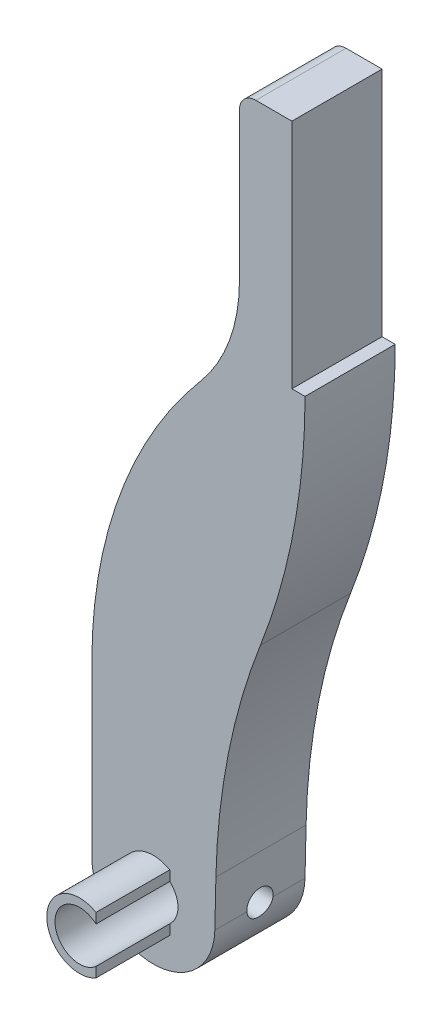
ISO-10303-21;
HEADER;
FILE_DESCRIPTION(('STEP AP214'),'2;1');
FILE_NAME('part.step','',(''),(''),'','','');
FILE_SCHEMA(('AUTOMOTIVE_DESIGN { 1 0 10303 214 1 1 1 1 }'));
ENDSEC;
DATA;
#1=APPLICATION_CONTEXT('core data for automotive mechanical design processes');
#2=APPLICATION_PROTOCOL_DEFINITION('international standard','automotive_design',2000,#1);
#3=PRODUCT_CONTEXT('',#1,'mechanical');
#4=PRODUCT('Part','Part','',(#3));
#5=PRODUCT_RELATED_PRODUCT_CATEGORY('part','',(#4));
#6=PRODUCT_DEFINITION_FORMATION('','',#4);
#7=PRODUCT_DEFINITION_CONTEXT('part definition',#1,'design');
#8=PRODUCT_DEFINITION('design','',#6,#7);
#9=PRODUCT_DEFINITION_SHAPE('','',#8);
#10=(LENGTH_UNIT() NAMED_UNIT(*) SI_UNIT(.MILLI.,.METRE.));
#11=(NAMED_UNIT(*) PLANE_ANGLE_UNIT() SI_UNIT($,.RADIAN.));
#12=(NAMED_UNIT(*) SI_UNIT($,.STERADIAN.) SOLID_ANGLE_UNIT());
#13=UNCERTAINTY_MEASURE_WITH_UNIT(LENGTH_MEASURE(1.E-05),#10,'distance_accuracy_value','');
#14=(GEOMETRIC_REPRESENTATION_CONTEXT(3) GLOBAL_UNCERTAINTY_ASSIGNED_CONTEXT((#13)) GLOBAL_UNIT_ASSIGNED_CONTEXT((#10,
#11,#12)) REPRESENTATION_CONTEXT('',''));
#15=CARTESIAN_POINT('',(0.,0.,0.));
#16=DIRECTION('',(0.,0.,1.));
#17=DIRECTION('',(1.,0.,0.));
#18=AXIS2_PLACEMENT_3D('',#15,#16,#17);
#19=CARTESIAN_POINT('',(0.,0.,-5.5));
#20=DIRECTION('',(0.,0.,1.));
#21=DIRECTION('',(-1.,0.,0.));
#22=AXIS2_PLACEMENT_3D('',#19,#20,#21);
#23=CYLINDRICAL_SURFACE('',#22,1.5);
#24=CARTESIAN_POINT('',(0.,0.,-5.5));
#25=DIRECTION('',(0.,0.,1.));
#26=DIRECTION('',(1.,0.,0.));
#27=AXIS2_PLACEMENT_3D('',#24,#25,#26);
#28=CIRCLE('',#27,1.5);
#29=CARTESIAN_POINT('',(1.5,0.,-5.5));
#30=VERTEX_POINT('',#29);
#31=EDGE_CURVE('E237',#30,#30,#28,.T.);
#32=ORIENTED_EDGE('',*,*,#31,.F.);
#33=EDGE_LOOP('',(#32));
#34=FACE_BOUND('',#33,.T.);
#35=DIRECTION('',(0.,0.,-1.));
#36=VECTOR('',#35,1.);
#37=CARTESIAN_POINT('',(1.,1.1180339887499,4.5));
#38=LINE('',#37,#36);
#39=CARTESIAN_POINT('',(1.,1.1180339887499,4.5));
#40=VERTEX_POINT('',#39);
#41=CARTESIAN_POINT('',(1.,1.1180339887499,0.));
#42=VERTEX_POINT('',#41);
#43=EDGE_CURVE('E188',#40,#42,#38,.T.);
#44=ORIENTED_EDGE('',*,*,#43,.F.);
#45=CARTESIAN_POINT('',(0.,0.,4.5));
#46=DIRECTION('',(0.,0.,-1.));
#47=DIRECTION('',(-1.,0.,0.));
#48=AXIS2_PLACEMENT_3D('',#45,#46,#47);
#49=CIRCLE('',#48,1.5);
#50=CARTESIAN_POINT('',(1.,-1.11803398874989,4.5));
#51=VERTEX_POINT('',#50);
#52=EDGE_CURVE('E199',#40,#51,#49,.F.);
#53=ORIENTED_EDGE('',*,*,#52,.T.);
#54=DIRECTION('',(0.,0.,-1.));
#55=VECTOR('',#54,1.);
#56=CARTESIAN_POINT('',(1.,-1.11803398874989,4.5));
#57=LINE('',#56,#55);
#58=CARTESIAN_POINT('',(1.,-1.1180339887499,0.));
#59=VERTEX_POINT('',#58);
#60=EDGE_CURVE('E190',#51,#59,#57,.T.);
#61=ORIENTED_EDGE('',*,*,#60,.T.);
#62=CARTESIAN_POINT('',(0.,0.,0.));
#63=DIRECTION('',(0.,0.,1.));
#64=DIRECTION('',(1.,0.,0.));
#65=AXIS2_PLACEMENT_3D('',#62,#63,#64);
#66=CIRCLE('',#65,1.5);
#67=EDGE_CURVE('E175',#59,#42,#66,.T.);
#68=ORIENTED_EDGE('',*,*,#67,.T.);
#69=EDGE_LOOP('',(#44,#53,#61,#68));
#70=FACE_BOUND('',#69,.T.);
#71=CARTESIAN_POINT('',(1.5,0.,-1.95000000000001));
#72=CARTESIAN_POINT('',(1.49999758414449,-0.0417140042937087,-1.95000270828979));
#73=CARTESIAN_POINT('',(1.49824189360224,-0.0834672912539162,-1.95328159641245));
#74=CARTESIAN_POINT('',(1.49139129667971,-0.165718197334507,-1.96624170086606));
#75=CARTESIAN_POINT('',(1.48629121869364,-0.206213769841146,-1.97593283300352));
#76=CARTESIAN_POINT('',(1.47328036800654,-0.284638594945809,-2.00121983985832));
#77=CARTESIAN_POINT('',(1.46538097991501,-0.32257751223757,-2.01679181418989));
#78=CARTESIAN_POINT('',(1.4474774987237,-0.395235474229209,-2.05326255171199));
#79=CARTESIAN_POINT('',(1.43747339607277,-0.42995450431626,-2.07416133907561));
#80=CARTESIAN_POINT('',(1.41547900666032,-0.497767319459635,-2.12225156173176));
#81=CARTESIAN_POINT('',(1.40340114810731,-0.530602027463181,-2.14976760351976));
#82=CARTESIAN_POINT('',(1.37887042167268,-0.591434030661648,-2.20960314568675));
#83=CARTESIAN_POINT('',(1.36641723648964,-0.619427089896361,-2.24192680673366));
#84=CARTESIAN_POINT('',(1.34122140682262,-0.672354419511093,-2.31397805847776));
#85=CARTESIAN_POINT('',(1.32855595701366,-0.696776837026738,-2.35411204866305));
#86=CARTESIAN_POINT('',(1.30586838669548,-0.738426416316989,-2.43864568135117));
#87=CARTESIAN_POINT('',(1.29584422578236,-0.755659138193525,-2.48304199480675));
#88=CARTESIAN_POINT('',(1.28057394848524,-0.781243551670875,-2.57205426936129));
#89=CARTESIAN_POINT('',(1.27506829565278,-0.790083117424784,-2.61648297209041));
#90=CARTESIAN_POINT('',(1.26881331156943,-0.800094972405441,-2.70650387196576));
#91=CARTESIAN_POINT('',(1.26805797215383,-0.801276946959547,-2.75209452613423));
#92=CARTESIAN_POINT('',(1.27118648805136,-0.796296021649245,-2.83622186564664));
#93=CARTESIAN_POINT('',(1.27443251356391,-0.791143222976698,-2.87484844662223));
#94=CARTESIAN_POINT('',(1.28406317281932,-0.775413455073676,-2.950574623942));
#95=CARTESIAN_POINT('',(1.2904490691478,-0.764834303757529,-2.98767359950573));
#96=CARTESIAN_POINT('',(1.30576277857079,-0.738390252390655,-3.06033802657356));
#97=CARTESIAN_POINT('',(1.31474447400447,-0.722411944930867,-3.09585030308501));
#98=CARTESIAN_POINT('',(1.3342504708289,-0.685716522966981,-3.1638695263574));
#99=CARTESIAN_POINT('',(1.34477545505385,-0.664997308543684,-3.19637513236902));
#100=CARTESIAN_POINT('',(1.36804524940246,-0.615868522436837,-3.26248586121327));
#101=CARTESIAN_POINT('',(1.38088899493242,-0.586776291159885,-3.2955507352467));
#102=CARTESIAN_POINT('',(1.40611558623123,-0.523451373374346,-3.35657535768995));
#103=CARTESIAN_POINT('',(1.41849814710228,-0.489215573049456,-3.38453199079312));
#104=CARTESIAN_POINT('',(1.44230010999534,-0.414022077031175,-3.4361377149142));
#105=CARTESIAN_POINT('',(1.45361823088172,-0.372785484410786,-3.4594311081939));
#106=CARTESIAN_POINT('',(1.47310395304255,-0.28622685973614,-3.4985478831769));
#107=CARTESIAN_POINT('',(1.48127436501701,-0.240908517249553,-3.51437793200311));
#108=CARTESIAN_POINT('',(1.4929099561423,-0.151832213955901,-3.53667761240727));
#109=CARTESIAN_POINT('',(1.49673204992477,-0.108300131382028,-3.54386070130998));
#110=CARTESIAN_POINT('',(1.50050221027202,-0.020489597541201,-3.55094750320043));
#111=CARTESIAN_POINT('',(1.50045251716091,0.0237884072844025,-3.55085542580228));
#112=CARTESIAN_POINT('',(1.49667382258832,0.107545959760609,-3.54375007116932));
#113=CARTESIAN_POINT('',(1.49327897244287,0.147096449267733,-3.53736535925173));
#114=CARTESIAN_POINT('',(1.48362188327846,0.224469554831582,-3.51889255790207));
#115=CARTESIAN_POINT('',(1.47735934596487,0.262291990687247,-3.5068038751433));
#116=CARTESIAN_POINT('',(1.46232570811689,0.336250167522201,-3.47702505753176));
#117=CARTESIAN_POINT('',(1.4534959496239,0.372320333376868,-3.45920276508171));
#118=CARTESIAN_POINT('',(1.43413438081761,0.44106215741096,-3.41862484569839));
#119=CARTESIAN_POINT('',(1.42360190671964,0.473732482002723,-3.3958672936231));
#120=CARTESIAN_POINT('',(1.40047645695353,0.538489644606409,-3.34325519889226));
#121=CARTESIAN_POINT('',(1.38778372966929,0.570134865108249,-3.31290033267113));
#122=CARTESIAN_POINT('',(1.36252708549313,0.628109862741499,-3.24738716408484));
#123=CARTESIAN_POINT('',(1.34996329805962,0.654434715474708,-3.21222446170795));
#124=CARTESIAN_POINT('',(1.32549514327966,0.702740766308906,-3.13517351382496));
#125=CARTESIAN_POINT('',(1.31369210729127,0.72431024468917,-3.09299186122058));
#126=CARTESIAN_POINT('',(1.29347935062968,0.759824848176567,-3.00478990991382));
#127=CARTESIAN_POINT('',(1.28506480237658,0.773780830369475,-2.95877518587825));
#128=CARTESIAN_POINT('',(1.27372513461019,0.792295451806945,-2.86898615290245));
#129=CARTESIAN_POINT('',(1.27034308682665,0.797640611545237,-2.82543381628454));
#130=CARTESIAN_POINT('',(1.26816359887642,0.801103834511677,-2.73793968581964));
#131=CARTESIAN_POINT('',(1.26936303319563,0.799226824740032,-2.69399817787743));
#132=CARTESIAN_POINT('',(1.27570247677834,0.789056350744171,-2.61265364514195));
#133=CARTESIAN_POINT('',(1.28034575552509,0.781570591370396,-2.57510510927249));
#134=CARTESIAN_POINT('',(1.29238691721073,0.761493436479315,-2.50186604245893));
#135=CARTESIAN_POINT('',(1.29978582163339,0.748900147495975,-2.46617620611579));
#136=CARTESIAN_POINT('',(1.3170766557443,0.718080352112411,-2.39509522045344));
#137=CARTESIAN_POINT('',(1.3270984841184,0.699543207429624,-2.35987143258423));
#138=CARTESIAN_POINT('',(1.34833960706443,0.657671226676278,-2.29279806424025));
#139=CARTESIAN_POINT('',(1.35955954483522,0.634333807313357,-2.26095031464064));
#140=CARTESIAN_POINT('',(1.38387269806828,0.579583602633459,-2.19672690611971));
#141=CARTESIAN_POINT('',(1.39700212075102,0.547491018352171,-2.16494125955117));
#142=CARTESIAN_POINT('',(1.42222830059073,0.478150164559811,-2.10702772961191));
#143=CARTESIAN_POINT('',(1.43432438618419,0.440898582826816,-2.0809035088962));
#144=CARTESIAN_POINT('',(1.45651015109521,0.361022002622191,-2.03456604006335));
#145=CARTESIAN_POINT('',(1.4665441059256,0.318288665753901,-2.01451137357511));
#146=CARTESIAN_POINT('',(1.48303856571174,0.22939933163039,-1.98214637726613));
#147=CARTESIAN_POINT('',(1.48950860714735,0.183252846928626,-1.96981536787767));
#148=CARTESIAN_POINT('',(1.49584776109147,0.113807677907477,-1.95780732872793));
#149=CARTESIAN_POINT('',(1.49739944315896,0.0911777471195346,-1.95488511579837));
#150=CARTESIAN_POINT('',(1.49947623062919,0.0457024774465192,-1.95098069784148));
#151=CARTESIAN_POINT('',(1.50000132376498,0.0228571359907295,-1.94999851599604));
#152=CARTESIAN_POINT('',(1.5,0.,-1.95000000000001));
#153=B_SPLINE_CURVE_WITH_KNOTS('',3,(#71,#72,#73,#74,#75,#76,#77,#78,#79,#80,#81,#82,#83,#84,
#85,#86,#87,#88,#89,#90,#91,#92,#93,#94,#95,#96,#97,#98,#99,#100,#101,#102,#103,#104,#105,#106,
#107,#108,#109,#110,#111,#112,#113,#114,#115,#116,#117,#118,#119,#120,#121,#122,#123,#124,#125,
#126,#127,#128,#129,#130,#131,#132,#133,#134,#135,#136,#137,#138,#139,#140,#141,#142,#143,#144,
#145,#146,#147,#148,#149,#150,#151,#152),.UNSPECIFIED.,.T.,.F.,(4,2,2,2,2,2,2,2,2,2,2,2,2,2,2,2,
2,2,2,2,2,2,2,2,2,2,2,2,2,2,2,2,2,2,2,2,2,2,2,2,4),(0.,0.125049785968991,0.250293400579705,
0.375033395431376,0.499773956363367,0.63275893751772,0.765859685119305,0.911100210896846,
1.05622820677189,1.19228300426693,1.3281656858967,1.44492819552125,1.56173769541659,
1.68117137196063,1.80065805275815,1.93770170276476,2.07482865313356,2.22012229846779,
2.36528590361978,2.49740165319179,2.62944095746672,2.74950324975933,2.86957803367864,
2.99264692026343,3.11576390008817,3.25213772585138,3.38863720347793,3.53432584534741,
3.67980618389776,3.81103787448889,3.94218005404201,4.05738088818266,4.1726244687305,
4.29529226385598,4.41802624681404,4.55851375899378,4.69909188991151,4.8430766484675,
4.98667423094963,5.05519428454417,5.12371515689629),.UNSPECIFIED.);
#154=CARTESIAN_POINT('',(1.5,0.,-1.95000000000001));
#155=VERTEX_POINT('',#154);
#156=EDGE_CURVE('E47',#155,#155,#153,.T.);
#157=ORIENTED_EDGE('',*,*,#156,.T.);
#158=EDGE_LOOP('',(#157));
#159=FACE_BOUND('',#158,.T.);
#160=ADVANCED_FACE('F43',(#34,#70,#159),#23,.F.);
#161=CARTESIAN_POINT('',(0.,45.,-5.5));
#162=DIRECTION('',(0.,1.,0.));
#163=DIRECTION('',(0.,0.,-1.));
#164=AXIS2_PLACEMENT_3D('',#161,#162,#163);
#165=PLANE('',#164);
#166=DIRECTION('',(1.,0.,0.));
#167=VECTOR('',#166,1.);
#168=CARTESIAN_POINT('',(0.,45.,-5.5));
#169=LINE('',#168,#167);
#170=CARTESIAN_POINT('',(6.25,45.,-5.5));
#171=VERTEX_POINT('',#170);
#172=CARTESIAN_POINT('',(8.45,45.,-5.5));
#173=VERTEX_POINT('',#172);
#174=EDGE_CURVE('E231',#171,#173,#169,.T.);
#175=ORIENTED_EDGE('',*,*,#174,.F.);
#176=DIRECTION('',(0.,0.,1.));
#177=VECTOR('',#176,1.);
#178=CARTESIAN_POINT('',(6.25,45.,-5.5));
#179=LINE('',#178,#177);
#180=CARTESIAN_POINT('',(6.25,45.,0.));
#181=VERTEX_POINT('',#180);
#182=EDGE_CURVE('E57',#181,#171,#179,.F.);
#183=ORIENTED_EDGE('',*,*,#182,.F.);
#184=DIRECTION('',(1.,0.,0.));
#185=VECTOR('',#184,1.);
#186=CARTESIAN_POINT('',(0.,45.,0.));
#187=LINE('',#186,#185);
#188=CARTESIAN_POINT('',(8.45,45.,0.));
#189=VERTEX_POINT('',#188);
#190=EDGE_CURVE('E249',#181,#189,#187,.T.);
#191=ORIENTED_EDGE('',*,*,#190,.T.);
#192=DIRECTION('',(0.,0.,-1.));
#193=VECTOR('',#192,1.);
#194=CARTESIAN_POINT('',(8.45,45.,0.));
#195=LINE('',#194,#193);
#196=EDGE_CURVE('E204',#189,#173,#195,.T.);
#197=ORIENTED_EDGE('',*,*,#196,.T.);
#198=EDGE_LOOP('',(#175,#183,#191,#197));
#199=FACE_BOUND('',#198,.T.);
#200=ADVANCED_FACE('F308',(#199),#165,.T.);
#201=CARTESIAN_POINT('',(-3.75,0.,-5.5));
#202=DIRECTION('',(-1.,0.,0.));
#203=DIRECTION('',(0.,0.,-1.));
#204=AXIS2_PLACEMENT_3D('',#201,#202,#203);
#205=PLANE('',#204);
#206=DIRECTION('',(0.,1.,0.));
#207=VECTOR('',#206,1.);
#208=CARTESIAN_POINT('',(-3.75,0.,-5.5));
#209=LINE('',#208,#207);
#210=CARTESIAN_POINT('',(-3.75,0.,-5.5));
#211=VERTEX_POINT('',#210);
#212=CARTESIAN_POINT('',(-3.75,10.3938160554488,-5.5));
#213=VERTEX_POINT('',#212);
#214=EDGE_CURVE('E221',#211,#213,#209,.T.);
#215=ORIENTED_EDGE('',*,*,#214,.F.);
#216=DIRECTION('',(0.,0.,1.));
#217=VECTOR('',#216,1.);
#218=CARTESIAN_POINT('',(-3.75,0.,-5.5));
#219=LINE('',#218,#217);
#220=CARTESIAN_POINT('',(-3.75,0.,0.));
#221=VERTEX_POINT('',#220);
#222=EDGE_CURVE('E257',#211,#221,#219,.T.);
#223=ORIENTED_EDGE('',*,*,#222,.T.);
#224=DIRECTION('',(0.,1.,0.));
#225=VECTOR('',#224,1.);
#226=CARTESIAN_POINT('',(-3.75,0.,0.));
#227=LINE('',#226,#225);
#228=CARTESIAN_POINT('',(-3.75,10.3938160554488,0.));
#229=VERTEX_POINT('',#228);
#230=EDGE_CURVE('E218',#221,#229,#227,.T.);
#231=ORIENTED_EDGE('',*,*,#230,.T.);
#232=DIRECTION('',(0.,0.,1.));
#233=VECTOR('',#232,1.);
#234=CARTESIAN_POINT('',(-3.75,10.3938160554488,0.));
#235=LINE('',#234,#233);
#236=EDGE_CURVE('E268',#213,#229,#235,.T.);
#237=ORIENTED_EDGE('',*,*,#236,.F.);
#238=EDGE_LOOP('',(#215,#223,#231,#237));
#239=FACE_BOUND('',#238,.T.);
#240=ADVANCED_FACE('F343',(#239),#205,.T.);
#241=CARTESIAN_POINT('',(0.,0.,-5.5));
#242=DIRECTION('',(0.,0.,1.));
#243=DIRECTION('',(-1.,0.,0.));
#244=AXIS2_PLACEMENT_3D('',#241,#242,#243);
#245=CYLINDRICAL_SURFACE('',#244,3.75);
#246=DIRECTION('',(0.,0.,1.));
#247=VECTOR('',#246,1.);
#248=CARTESIAN_POINT('',(3.74903561376502,-0.0850409708409687,-5.5));
#249=LINE('',#248,#247);
#250=CARTESIAN_POINT('',(3.74903561376502,-0.0850409708409675,-1.95453282074091));
#251=VERTEX_POINT('',#250);
#252=CARTESIAN_POINT('',(3.74903561376502,-0.0850409708409687,0.));
#253=VERTEX_POINT('',#252);
#254=EDGE_CURVE('E240',#251,#253,#249,.T.);
#255=ORIENTED_EDGE('',*,*,#254,.T.);
#256=CARTESIAN_POINT('',(0.,0.,0.));
#257=DIRECTION('',(0.,0.,1.));
#258=DIRECTION('',(1.,0.,0.));
#259=AXIS2_PLACEMENT_3D('',#256,#257,#258);
#260=CIRCLE('',#259,3.75);
#261=EDGE_CURVE('E243',#221,#253,#260,.T.);
#262=ORIENTED_EDGE('',*,*,#261,.F.);
#263=ORIENTED_EDGE('',*,*,#222,.F.);
#264=CARTESIAN_POINT('',(0.,0.,-5.5));
#265=DIRECTION('',(0.,0.,1.));
#266=DIRECTION('',(1.,0.,0.));
#267=AXIS2_PLACEMENT_3D('',#264,#265,#266);
#268=CIRCLE('',#267,3.75);
#269=CARTESIAN_POINT('',(3.74903561376502,-0.0850409708409687,-5.5));
#270=VERTEX_POINT('',#269);
#271=EDGE_CURVE('E224',#211,#270,#268,.T.);
#272=ORIENTED_EDGE('',*,*,#271,.T.);
#273=CARTESIAN_POINT('',(3.74903561376502,-0.0850409708409687,-3.54546717925909));
#274=VERTEX_POINT('',#273);
#275=EDGE_CURVE('E254',#270,#274,#249,.T.);
#276=ORIENTED_EDGE('',*,*,#275,.T.);
#277=CARTESIAN_POINT('',(3.74903561376502,-0.0850409708409675,-1.95453282074091));
#278=CARTESIAN_POINT('',(3.74805415300405,-0.129509323442886,-1.95924778875326));
#279=CARTESIAN_POINT('',(3.74623755099002,-0.173526151933674,-1.96776051001984));
#280=CARTESIAN_POINT('',(3.74125681236144,-0.259403806723804,-1.9919240320155));
#281=CARTESIAN_POINT('',(3.73809480827317,-0.301267927963616,-2.00756353922264));
#282=CARTESIAN_POINT('',(3.7307409787115,-0.381734258207301,-2.04554046815485));
#283=CARTESIAN_POINT('',(3.72654917562884,-0.420336538108266,-2.06787774425389));
#284=CARTESIAN_POINT('',(3.71759831498908,-0.493265206513346,-2.11860337423482));
#285=CARTESIAN_POINT('',(3.71283917669202,-0.527590984984936,-2.14699258984882));
#286=CARTESIAN_POINT('',(3.70319924524376,-0.591504368113251,-2.20949266388859));
#287=CARTESIAN_POINT('',(3.69831768042599,-0.621019575495766,-2.24367748536772));
#288=CARTESIAN_POINT('',(3.68904573728563,-0.67391738630563,-2.31656815047515));
#289=CARTESIAN_POINT('',(3.68465540513059,-0.697299413595235,-2.35527441834513));
#290=CARTESIAN_POINT('',(3.67686293317514,-0.737290341640546,-2.43623970204815));
#291=CARTESIAN_POINT('',(3.67346287944376,-0.753884973712442,-2.47850597933928));
#292=CARTESIAN_POINT('',(3.66806961619079,-0.779705787030844,-2.56531491236112));
#293=CARTESIAN_POINT('',(3.66607613900039,-0.788933370256543,-2.60985713325305));
#294=CARTESIAN_POINT('',(3.66376204937183,-0.799610658611996,-2.69901816200616));
#295=CARTESIAN_POINT('',(3.66340937153717,-0.801209465539383,-2.743618308173));
#296=CARTESIAN_POINT('',(3.66433146691338,-0.796981452607694,-2.83244606704419));
#297=CARTESIAN_POINT('',(3.66560614709605,-0.791155057211566,-2.87667370089779));
#298=CARTESIAN_POINT('',(3.66960975480597,-0.772369076069668,-2.9630210087098));
#299=CARTESIAN_POINT('',(3.67232313545794,-0.759485701095699,-3.00515804864048));
#300=CARTESIAN_POINT('',(3.67888558259117,-0.727030490119211,-3.08667775067867));
#301=CARTESIAN_POINT('',(3.68273477503321,-0.707457912250301,-3.12606010669398));
#302=CARTESIAN_POINT('',(3.69120804495017,-0.661836559926988,-3.2016071523052));
#303=CARTESIAN_POINT('',(3.6958429723182,-0.63569421830607,-3.23771409624877));
#304=CARTESIAN_POINT('',(3.70533445032447,-0.577801870691906,-3.30508369913515));
#305=CARTESIAN_POINT('',(3.71019103237354,-0.546051068078693,-3.336345668717));
#306=CARTESIAN_POINT('',(3.71968088422452,-0.477180871329728,-3.39369376656846));
#307=CARTESIAN_POINT('',(3.72430874232471,-0.439977073046593,-3.41967948211682));
#308=CARTESIAN_POINT('',(3.73272770568102,-0.361650912196757,-3.46501997111467));
#309=CARTESIAN_POINT('',(3.73651927325314,-0.320530732767691,-3.48437841152215));
#310=CARTESIAN_POINT('',(3.74198559178908,-0.247005502673364,-3.51163323698713));
#311=CARTESIAN_POINT('',(3.74395542483222,-0.215235118788971,-3.52121239368504));
#312=CARTESIAN_POINT('',(3.74711009534407,-0.150739411556858,-3.53636991205753));
#313=CARTESIAN_POINT('',(3.74829545607211,-0.118014739981069,-3.54195094077184));
#314=CARTESIAN_POINT('',(3.74903561376502,-0.0850409708409677,-3.54546717925909));
#315=B_SPLINE_CURVE_WITH_KNOTS('',3,(#277,#278,#279,#280,#281,#282,#283,#284,#285,#286,#287,
#288,#289,#290,#291,#292,#293,#294,#295,#296,#297,#298,#299,#300,#301,#302,#303,#304,#305,#306,
#307,#308,#309,#310,#311,#312,#313,#314),.UNSPECIFIED.,.F.,.F.,(4,2,2,2,2,2,2,2,2,2,2,2,2,2,2,2,
2,2,4),(0.,0.133978467544929,0.26774535933787,0.401509342919253,0.535292385813053,
0.670932770094501,0.806585891582376,0.94252273962846,1.0784337121721,1.21167715958448,
1.3449129904543,1.4767375441898,1.60857672268104,1.74241203526557,1.87626637298726,
2.0124687434796,2.14859562915219,2.24806847892292,2.34747491118305),.UNSPECIFIED.);
#316=EDGE_CURVE('E191',#251,#274,#315,.T.);
#317=ORIENTED_EDGE('',*,*,#316,.F.);
#318=EDGE_LOOP('',(#255,#262,#263,#272,#276,#317));
#319=FACE_BOUND('',#318,.T.);
#320=ADVANCED_FACE('F339',(#319),#245,.T.);
#321=CARTESIAN_POINT('',(3.74903561376501,-0.0850409708409688,-5.5));
#322=DIRECTION('',(-0.999742830337337,0.0226775922242584,0.));
#323=DIRECTION('',(-0.0226775922242584,-0.999742830337337,0.));
#324=AXIS2_PLACEMENT_3D('',#321,#322,#323);
#325=PLANE('',#324);
#326=ORIENTED_EDGE('',*,*,#275,.F.);
#327=DIRECTION('',(0.0226775922242584,0.999742830337338,0.));
#328=VECTOR('',#327,1.);
#329=CARTESIAN_POINT('',(3.74903561376501,-0.0850409708409688,-5.5));
#330=LINE('',#329,#328);
#331=CARTESIAN_POINT('',(3.81347438844907,2.75574575594353,-5.5));
#332=VERTEX_POINT('',#331);
#333=EDGE_CURVE('E228',#270,#332,#330,.T.);
#334=ORIENTED_EDGE('',*,*,#333,.T.);
#335=DIRECTION('',(0.,0.,-1.));
#336=VECTOR('',#335,1.);
#337=CARTESIAN_POINT('',(3.81347438844907,2.75574575594353,-5.5));
#338=LINE('',#337,#336);
#339=CARTESIAN_POINT('',(3.81347438844907,2.75574575594353,0.));
#340=VERTEX_POINT('',#339);
#341=EDGE_CURVE('E278',#340,#332,#338,.T.);
#342=ORIENTED_EDGE('',*,*,#341,.F.);
#343=DIRECTION('',(0.0226775922242584,0.999742830337338,0.));
#344=VECTOR('',#343,1.);
#345=CARTESIAN_POINT('',(3.74903561376501,-0.0850409708409688,0.));
#346=LINE('',#345,#344);
#347=EDGE_CURVE('E246',#253,#340,#346,.T.);
#348=ORIENTED_EDGE('',*,*,#347,.F.);
#349=ORIENTED_EDGE('',*,*,#254,.F.);
#350=CARTESIAN_POINT('',(3.75096463430966,0.,-2.75));
#351=DIRECTION('',(0.999742830337337,-0.0226775922242584,0.));
#352=DIRECTION('',(0.0226775922242584,0.999742830337337,0.));
#353=AXIS2_PLACEMENT_3D('',#350,#351,#352);
#354=ELLIPSE('',#353,0.800205788652721,0.799999999999993);
#355=EDGE_CURVE('E64',#274,#251,#354,.T.);
#356=ORIENTED_EDGE('',*,*,#355,.F.);
#357=EDGE_LOOP('',(#326,#334,#342,#348,#349,#356));
#358=FACE_BOUND('',#357,.T.);
#359=ADVANCED_FACE('F334',(#358),#325,.F.);
#360=CARTESIAN_POINT('',(5.25,0.,-5.5));
#361=DIRECTION('',(-1.,0.,0.));
#362=DIRECTION('',(0.,-1.,0.));
#363=AXIS2_PLACEMENT_3D('',#360,#361,#362);
#364=PLANE('',#363);
#365=DIRECTION('',(0.,1.,0.));
#366=VECTOR('',#365,1.);
#367=CARTESIAN_POINT('',(5.25,0.,-5.5));
#368=LINE('',#367,#366);
#369=CARTESIAN_POINT('',(5.25,34.9498743710662,-5.5));
#370=VERTEX_POINT('',#369);
#371=CARTESIAN_POINT('',(5.25,44.,-5.5));
#372=VERTEX_POINT('',#371);
#373=EDGE_CURVE('E234',#370,#372,#368,.T.);
#374=ORIENTED_EDGE('',*,*,#373,.F.);
#375=DIRECTION('',(0.,0.,1.));
#376=VECTOR('',#375,1.);
#377=CARTESIAN_POINT('',(5.25,34.9498743710662,-5.5));
#378=LINE('',#377,#376);
#379=CARTESIAN_POINT('',(5.25,34.9498743710662,0.));
#380=VERTEX_POINT('',#379);
#381=EDGE_CURVE('E260',#380,#370,#378,.F.);
#382=ORIENTED_EDGE('',*,*,#381,.F.);
#383=DIRECTION('',(0.,1.,0.));
#384=VECTOR('',#383,1.);
#385=CARTESIAN_POINT('',(5.25,0.,0.));
#386=LINE('',#385,#384);
#387=CARTESIAN_POINT('',(5.25,44.,0.));
#388=VERTEX_POINT('',#387);
#389=EDGE_CURVE('E225',#380,#388,#386,.T.);
#390=ORIENTED_EDGE('',*,*,#389,.T.);
#391=DIRECTION('',(0.,0.,1.));
#392=VECTOR('',#391,1.);
#393=CARTESIAN_POINT('',(5.25,44.,-5.5));
#394=LINE('',#393,#392);
#395=EDGE_CURVE('E296',#372,#388,#394,.T.);
#396=ORIENTED_EDGE('',*,*,#395,.F.);
#397=EDGE_LOOP('',(#374,#382,#390,#396));
#398=FACE_BOUND('',#397,.T.);
#399=ADVANCED_FACE('F317',(#398),#364,.T.);
#400=CARTESIAN_POINT('',(0.,0.,-5.5));
#401=DIRECTION('',(0.,0.,-1.));
#402=DIRECTION('',(1.,0.,0.));
#403=AXIS2_PLACEMENT_3D('',#400,#401,#402);
#404=PLANE('',#403);
#405=ORIENTED_EDGE('',*,*,#31,.T.);
#406=EDGE_LOOP('',(#405));
#407=FACE_BOUND('',#406,.T.);
#408=DIRECTION('',(1.,0.,0.));
#409=VECTOR('',#408,1.);
#410=CARTESIAN_POINT('',(8.45,30.8628147828987,-5.5));
#411=LINE('',#410,#409);
#412=CARTESIAN_POINT('',(8.45,30.8628147828987,-5.5));
#413=VERTEX_POINT('',#412);
#414=CARTESIAN_POINT('',(9.25,30.8628147828987,-5.5));
#415=VERTEX_POINT('',#414);
#416=EDGE_CURVE('E214',#413,#415,#411,.T.);
#417=ORIENTED_EDGE('',*,*,#416,.T.);
#418=CARTESIAN_POINT('',(-30.75,30.8628147828987,-5.5));
#419=DIRECTION('',(0.,0.,1.));
#420=DIRECTION('',(1.,0.,0.));
#421=AXIS2_PLACEMENT_3D('',#418,#419,#420);
#422=CIRCLE('',#421,40.);
#423=CARTESIAN_POINT('',(6.52659380097128,16.3557284249359,-5.5));
#424=VERTEX_POINT('',#423);
#425=EDGE_CURVE('E293',#424,#415,#422,.T.);
#426=ORIENTED_EDGE('',*,*,#425,.F.);
#427=CARTESIAN_POINT('',(43.8031876019426,1.84864206697319,-5.5));
#428=DIRECTION('',(0.,0.,1.));
#429=DIRECTION('',(1.,0.,0.));
#430=AXIS2_PLACEMENT_3D('',#427,#428,#429);
#431=CIRCLE('',#430,40.);
#432=EDGE_CURVE('E283',#332,#424,#431,.F.);
#433=ORIENTED_EDGE('',*,*,#432,.F.);
#434=ORIENTED_EDGE('',*,*,#333,.F.);
#435=ORIENTED_EDGE('',*,*,#271,.F.);
#436=ORIENTED_EDGE('',*,*,#214,.T.);
#437=CARTESIAN_POINT('',(24.25,10.3938160554488,-5.5));
#438=DIRECTION('',(0.,0.,1.));
#439=DIRECTION('',(1.,0.,0.));
#440=AXIS2_PLACEMENT_3D('',#437,#438,#439);
#441=CIRCLE('',#440,28.);
#442=CARTESIAN_POINT('',(2.88157894736842,28.4877537616932,-5.5));
#443=VERTEX_POINT('',#442);
#444=EDGE_CURVE('E276',#443,#213,#441,.T.);
#445=ORIENTED_EDGE('',*,*,#444,.F.);
#446=CARTESIAN_POINT('',(-4.75,34.9498743710662,-5.5));
#447=DIRECTION('',(0.,0.,1.));
#448=DIRECTION('',(1.,0.,0.));
#449=AXIS2_PLACEMENT_3D('',#446,#447,#448);
#450=CIRCLE('',#449,10.);
#451=EDGE_CURVE('E265',#370,#443,#450,.F.);
#452=ORIENTED_EDGE('',*,*,#451,.F.);
#453=ORIENTED_EDGE('',*,*,#373,.T.);
#454=CARTESIAN_POINT('',(6.25,44.,-5.5));
#455=DIRECTION('',(0.,0.,1.));
#456=DIRECTION('',(1.,0.,0.));
#457=AXIS2_PLACEMENT_3D('',#454,#455,#456);
#458=CIRCLE('',#457,1.);
#459=EDGE_CURVE('E11',#171,#372,#458,.T.);
#460=ORIENTED_EDGE('',*,*,#459,.F.);
#461=ORIENTED_EDGE('',*,*,#174,.T.);
#462=DIRECTION('',(0.,-1.,0.));
#463=VECTOR('',#462,1.);
#464=CARTESIAN_POINT('',(8.45,45.,-5.5));
#465=LINE('',#464,#463);
#466=EDGE_CURVE('E207',#173,#413,#465,.T.);
#467=ORIENTED_EDGE('',*,*,#466,.T.);
#468=EDGE_LOOP('',(#417,#426,#433,#434,#435,#436,#445,#452,#453,#460,#461,#467));
#469=FACE_BOUND('',#468,.T.);
#470=ADVANCED_FACE('F311',(#407,#469),#404,.T.);
#471=CARTESIAN_POINT('',(0.,0.,0.));
#472=DIRECTION('',(0.,0.,-1.));
#473=DIRECTION('',(1.,0.,0.));
#474=AXIS2_PLACEMENT_3D('',#471,#472,#473);
#475=PLANE('',#474);
#476=DIRECTION('',(0.,-1.,0.));
#477=VECTOR('',#476,1.);
#478=CARTESIAN_POINT('',(1.,0.,0.));
#479=LINE('',#478,#477);
#480=CARTESIAN_POINT('',(1.,-1.73205080756888,0.));
#481=VERTEX_POINT('',#480);
#482=EDGE_CURVE('E183',#59,#481,#479,.T.);
#483=ORIENTED_EDGE('',*,*,#482,.T.);
#484=CARTESIAN_POINT('',(0.,0.,0.));
#485=DIRECTION('',(0.,0.,-1.));
#486=DIRECTION('',(-1.,0.,0.));
#487=AXIS2_PLACEMENT_3D('',#484,#485,#486);
#488=CIRCLE('',#487,2.);
#489=CARTESIAN_POINT('',(1.,1.73205080756888,0.));
#490=VERTEX_POINT('',#489);
#491=EDGE_CURVE('E177',#481,#490,#488,.T.);
#492=ORIENTED_EDGE('',*,*,#491,.T.);
#493=EDGE_CURVE('E170',#490,#42,#479,.T.);
#494=ORIENTED_EDGE('',*,*,#493,.T.);
#495=ORIENTED_EDGE('',*,*,#67,.F.);
#496=EDGE_LOOP('',(#483,#492,#494,#495));
#497=FACE_BOUND('',#496,.T.);
#498=DIRECTION('',(0.,1.,0.));
#499=VECTOR('',#498,1.);
#500=CARTESIAN_POINT('',(8.45,30.8628147828987,0.));
#501=LINE('',#500,#499);
#502=CARTESIAN_POINT('',(8.45,30.8628147828987,0.));
#503=VERTEX_POINT('',#502);
#504=EDGE_CURVE('E212',#503,#189,#501,.T.);
#505=ORIENTED_EDGE('',*,*,#504,.T.);
#506=ORIENTED_EDGE('',*,*,#190,.F.);
#507=CARTESIAN_POINT('',(6.25,44.,0.));
#508=DIRECTION('',(0.,0.,1.));
#509=DIRECTION('',(1.,0.,0.));
#510=AXIS2_PLACEMENT_3D('',#507,#508,#509);
#511=CIRCLE('',#510,1.);
#512=EDGE_CURVE('E299',#388,#181,#511,.F.);
#513=ORIENTED_EDGE('',*,*,#512,.F.);
#514=ORIENTED_EDGE('',*,*,#389,.F.);
#515=CARTESIAN_POINT('',(-4.75,34.9498743710662,0.));
#516=DIRECTION('',(0.,0.,1.));
#517=DIRECTION('',(1.,0.,0.));
#518=AXIS2_PLACEMENT_3D('',#515,#516,#517);
#519=CIRCLE('',#518,10.);
#520=CARTESIAN_POINT('',(2.88157894736842,28.4877537616932,0.));
#521=VERTEX_POINT('',#520);
#522=EDGE_CURVE('E263',#521,#380,#519,.T.);
#523=ORIENTED_EDGE('',*,*,#522,.F.);
#524=CARTESIAN_POINT('',(24.25,10.3938160554488,0.));
#525=DIRECTION('',(0.,0.,1.));
#526=DIRECTION('',(1.,0.,0.));
#527=AXIS2_PLACEMENT_3D('',#524,#525,#526);
#528=CIRCLE('',#527,28.);
#529=EDGE_CURVE('E271',#229,#521,#528,.F.);
#530=ORIENTED_EDGE('',*,*,#529,.F.);
#531=ORIENTED_EDGE('',*,*,#230,.F.);
#532=ORIENTED_EDGE('',*,*,#261,.T.);
#533=ORIENTED_EDGE('',*,*,#347,.T.);
#534=CARTESIAN_POINT('',(43.8031876019426,1.84864206697319,0.));
#535=DIRECTION('',(0.,0.,1.));
#536=DIRECTION('',(1.,0.,0.));
#537=AXIS2_PLACEMENT_3D('',#534,#535,#536);
#538=CIRCLE('',#537,40.);
#539=CARTESIAN_POINT('',(6.52659380097128,16.3557284249359,0.));
#540=VERTEX_POINT('',#539);
#541=EDGE_CURVE('E281',#540,#340,#538,.T.);
#542=ORIENTED_EDGE('',*,*,#541,.F.);
#543=CARTESIAN_POINT('',(-30.75,30.8628147828987,0.));
#544=DIRECTION('',(0.,0.,1.));
#545=DIRECTION('',(1.,0.,0.));
#546=AXIS2_PLACEMENT_3D('',#543,#544,#545);
#547=CIRCLE('',#546,40.);
#548=CARTESIAN_POINT('',(9.25,30.8628147828987,0.));
#549=VERTEX_POINT('',#548);
#550=EDGE_CURVE('E288',#549,#540,#547,.F.);
#551=ORIENTED_EDGE('',*,*,#550,.F.);
#552=DIRECTION('',(1.,0.,0.));
#553=VECTOR('',#552,1.);
#554=CARTESIAN_POINT('',(8.45,30.8628147828987,0.));
#555=LINE('',#554,#553);
#556=EDGE_CURVE('E215',#503,#549,#555,.T.);
#557=ORIENTED_EDGE('',*,*,#556,.F.);
#558=EDGE_LOOP('',(#505,#506,#513,#514,#523,#530,#531,#532,#533,#542,#551,#557));
#559=FACE_BOUND('',#558,.T.);
#560=ADVANCED_FACE('F173',(#497,#559),#475,.F.);
#561=CARTESIAN_POINT('',(-4.75,34.9498743710662,-5.5));
#562=DIRECTION('',(0.,0.,-1.));
#563=DIRECTION('',(1.,0.,0.));
#564=AXIS2_PLACEMENT_3D('',#561,#562,#563);
#565=CYLINDRICAL_SURFACE('',#564,10.);
#566=ORIENTED_EDGE('',*,*,#522,.T.);
#567=ORIENTED_EDGE('',*,*,#381,.T.);
#568=ORIENTED_EDGE('',*,*,#451,.T.);
#569=DIRECTION('',(0.,0.,-1.));
#570=VECTOR('',#569,1.);
#571=CARTESIAN_POINT('',(2.88157894736842,28.4877537616932,-5.5));
#572=LINE('',#571,#570);
#573=EDGE_CURVE('E274',#521,#443,#572,.T.);
#574=ORIENTED_EDGE('',*,*,#573,.F.);
#575=EDGE_LOOP('',(#566,#567,#568,#574));
#576=FACE_BOUND('',#575,.T.);
#577=ADVANCED_FACE('F347',(#576),#565,.F.);
#578=CARTESIAN_POINT('',(24.25,10.3938160554488,-5.5));
#579=DIRECTION('',(0.,0.,-1.));
#580=DIRECTION('',(1.,0.,0.));
#581=AXIS2_PLACEMENT_3D('',#578,#579,#580);
#582=CYLINDRICAL_SURFACE('',#581,28.);
#583=ORIENTED_EDGE('',*,*,#444,.T.);
#584=ORIENTED_EDGE('',*,*,#236,.T.);
#585=ORIENTED_EDGE('',*,*,#529,.T.);
#586=ORIENTED_EDGE('',*,*,#573,.T.);
#587=EDGE_LOOP('',(#583,#584,#585,#586));
#588=FACE_BOUND('',#587,.T.);
#589=ADVANCED_FACE('F345',(#588),#582,.T.);
#590=CARTESIAN_POINT('',(43.8031876019426,1.84864206697319,-5.5));
#591=DIRECTION('',(0.,0.,-1.));
#592=DIRECTION('',(1.,0.,0.));
#593=AXIS2_PLACEMENT_3D('',#590,#591,#592);
#594=CYLINDRICAL_SURFACE('',#593,40.);
#595=ORIENTED_EDGE('',*,*,#541,.T.);
#596=ORIENTED_EDGE('',*,*,#341,.T.);
#597=ORIENTED_EDGE('',*,*,#432,.T.);
#598=DIRECTION('',(0.,0.,-1.));
#599=VECTOR('',#598,1.);
#600=CARTESIAN_POINT('',(6.52659380097127,16.3557284249359,-5.5));
#601=LINE('',#600,#599);
#602=EDGE_CURVE('E291',#540,#424,#601,.T.);
#603=ORIENTED_EDGE('',*,*,#602,.F.);
#604=EDGE_LOOP('',(#595,#596,#597,#603));
#605=FACE_BOUND('',#604,.T.);
#606=ADVANCED_FACE('F332',(#605),#594,.F.);
#607=CARTESIAN_POINT('',(-30.75,30.8628147828987,-5.5));
#608=DIRECTION('',(0.,0.,-1.));
#609=DIRECTION('',(1.,0.,0.));
#610=AXIS2_PLACEMENT_3D('',#607,#608,#609);
#611=CYLINDRICAL_SURFACE('',#610,40.);
#612=ORIENTED_EDGE('',*,*,#425,.T.);
#613=DIRECTION('',(0.,0.,1.));
#614=VECTOR('',#613,1.);
#615=CARTESIAN_POINT('',(9.25,30.8628147828987,0.));
#616=LINE('',#615,#614);
#617=EDGE_CURVE('E286',#415,#549,#616,.T.);
#618=ORIENTED_EDGE('',*,*,#617,.T.);
#619=ORIENTED_EDGE('',*,*,#550,.T.);
#620=ORIENTED_EDGE('',*,*,#602,.T.);
#621=EDGE_LOOP('',(#612,#618,#619,#620));
#622=FACE_BOUND('',#621,.T.);
#623=ADVANCED_FACE('F329',(#622),#611,.T.);
#624=CARTESIAN_POINT('',(6.25,44.,-5.5));
#625=DIRECTION('',(0.,0.,1.));
#626=DIRECTION('',(-1.,0.,0.));
#627=AXIS2_PLACEMENT_3D('',#624,#625,#626);
#628=CYLINDRICAL_SURFACE('',#627,1.);
#629=ORIENTED_EDGE('',*,*,#459,.T.);
#630=ORIENTED_EDGE('',*,*,#395,.T.);
#631=ORIENTED_EDGE('',*,*,#512,.T.);
#632=ORIENTED_EDGE('',*,*,#182,.T.);
#633=EDGE_LOOP('',(#629,#630,#631,#632));
#634=FACE_BOUND('',#633,.T.);
#635=ADVANCED_FACE('F45',(#634),#628,.T.);
#636=CARTESIAN_POINT('',(8.45,30.8628147828987,-5.5));
#637=DIRECTION('',(0.,-1.,0.));
#638=DIRECTION('',(1.,0.,0.));
#639=AXIS2_PLACEMENT_3D('',#636,#637,#638);
#640=PLANE('',#639);
#641=ORIENTED_EDGE('',*,*,#617,.F.);
#642=ORIENTED_EDGE('',*,*,#416,.F.);
#643=DIRECTION('',(0.,0.,1.));
#644=VECTOR('',#643,1.);
#645=CARTESIAN_POINT('',(8.45,30.8628147828987,-5.5));
#646=LINE('',#645,#644);
#647=EDGE_CURVE('E210',#413,#503,#646,.T.);
#648=ORIENTED_EDGE('',*,*,#647,.T.);
#649=ORIENTED_EDGE('',*,*,#556,.T.);
#650=EDGE_LOOP('',(#641,#642,#648,#649));
#651=FACE_BOUND('',#650,.T.);
#652=ADVANCED_FACE('F326',(#651),#640,.F.);
#653=CARTESIAN_POINT('',(8.45,0.,0.));
#654=DIRECTION('',(1.,0.,0.));
#655=DIRECTION('',(0.,1.,0.));
#656=AXIS2_PLACEMENT_3D('',#653,#654,#655);
#657=PLANE('',#656);
#658=ORIENTED_EDGE('',*,*,#196,.F.);
#659=ORIENTED_EDGE('',*,*,#504,.F.);
#660=ORIENTED_EDGE('',*,*,#647,.F.);
#661=ORIENTED_EDGE('',*,*,#466,.F.);
#662=EDGE_LOOP('',(#658,#659,#660,#661));
#663=FACE_BOUND('',#662,.T.);
#664=ADVANCED_FACE('F324',(#663),#657,.T.);
#665=CARTESIAN_POINT('',(1.,0.,4.5));
#666=DIRECTION('',(-1.,0.,0.));
#667=DIRECTION('',(0.,0.,-1.));
#668=AXIS2_PLACEMENT_3D('',#665,#666,#667);
#669=PLANE('',#668);
#670=ORIENTED_EDGE('',*,*,#482,.F.);
#671=ORIENTED_EDGE('',*,*,#60,.F.);
#672=DIRECTION('',(0.,-1.,0.));
#673=VECTOR('',#672,1.);
#674=CARTESIAN_POINT('',(1.,0.,4.5));
#675=LINE('',#674,#673);
#676=CARTESIAN_POINT('',(1.,-1.73205080756888,4.5));
#677=VERTEX_POINT('',#676);
#678=EDGE_CURVE('E181',#51,#677,#675,.T.);
#679=ORIENTED_EDGE('',*,*,#678,.T.);
#680=DIRECTION('',(0.,0.,-1.));
#681=VECTOR('',#680,1.);
#682=CARTESIAN_POINT('',(1.,-1.73205080756888,4.5));
#683=LINE('',#682,#681);
#684=EDGE_CURVE('E72',#677,#481,#683,.T.);
#685=ORIENTED_EDGE('',*,*,#684,.T.);
#686=EDGE_LOOP('',(#670,#671,#679,#685));
#687=FACE_BOUND('',#686,.T.);
#688=ADVANCED_FACE('F394',(#687),#669,.F.);
#689=CARTESIAN_POINT('',(0.,0.,4.5));
#690=DIRECTION('',(0.,0.,-1.));
#691=DIRECTION('',(1.,0.,0.));
#692=AXIS2_PLACEMENT_3D('',#689,#690,#691);
#693=CYLINDRICAL_SURFACE('',#692,2.);
#694=ORIENTED_EDGE('',*,*,#491,.F.);
#695=ORIENTED_EDGE('',*,*,#684,.F.);
#696=CARTESIAN_POINT('',(0.,0.,4.5));
#697=DIRECTION('',(0.,0.,-1.));
#698=DIRECTION('',(-1.,0.,0.));
#699=AXIS2_PLACEMENT_3D('',#696,#697,#698);
#700=CIRCLE('',#699,2.);
#701=CARTESIAN_POINT('',(1.,1.73205080756888,4.5));
#702=VERTEX_POINT('',#701);
#703=EDGE_CURVE('E591',#677,#702,#700,.T.);
#704=ORIENTED_EDGE('',*,*,#703,.T.);
#705=DIRECTION('',(0.,0.,-1.));
#706=VECTOR('',#705,1.);
#707=CARTESIAN_POINT('',(1.,1.73205080756888,4.5));
#708=LINE('',#707,#706);
#709=EDGE_CURVE('E196',#702,#490,#708,.T.);
#710=ORIENTED_EDGE('',*,*,#709,.T.);
#711=EDGE_LOOP('',(#694,#695,#704,#710));
#712=FACE_BOUND('',#711,.T.);
#713=ADVANCED_FACE('F393',(#712),#693,.T.);
#714=ORIENTED_EDGE('',*,*,#493,.F.);
#715=ORIENTED_EDGE('',*,*,#709,.F.);
#716=EDGE_CURVE('E194',#702,#40,#675,.T.);
#717=ORIENTED_EDGE('',*,*,#716,.T.);
#718=ORIENTED_EDGE('',*,*,#43,.T.);
#719=EDGE_LOOP('',(#714,#715,#717,#718));
#720=FACE_BOUND('',#719,.T.);
#721=ADVANCED_FACE('F193',(#720),#669,.F.);
#722=CARTESIAN_POINT('',(0.,0.,4.5));
#723=DIRECTION('',(0.,0.,1.));
#724=DIRECTION('',(-1.,0.,0.));
#725=AXIS2_PLACEMENT_3D('',#722,#723,#724);
#726=PLANE('',#725);
#727=ORIENTED_EDGE('',*,*,#678,.F.);
#728=ORIENTED_EDGE('',*,*,#52,.F.);
#729=ORIENTED_EDGE('',*,*,#716,.F.);
#730=ORIENTED_EDGE('',*,*,#703,.F.);
#731=EDGE_LOOP('',(#727,#728,#729,#730));
#732=FACE_BOUND('',#731,.T.);
#733=ADVANCED_FACE('F384',(#732),#726,.T.);
#734=CARTESIAN_POINT('',(11.,0.,-2.75));
#735=DIRECTION('',(1.,0.,0.));
#736=DIRECTION('',(0.,0.,1.));
#737=AXIS2_PLACEMENT_3D('',#734,#735,#736);
#738=CYLINDRICAL_SURFACE('',#737,0.799999999999993);
#739=ORIENTED_EDGE('',*,*,#156,.F.);
#740=EDGE_LOOP('',(#739));
#741=FACE_BOUND('',#740,.T.);
#742=ORIENTED_EDGE('',*,*,#316,.T.);
#743=ORIENTED_EDGE('',*,*,#355,.T.);
#744=EDGE_LOOP('',(#742,#743));
#745=FACE_BOUND('',#744,.T.);
#746=ADVANCED_FACE('F380',(#741,#745),#738,.F.);
#747=CLOSED_SHELL('',(#160,#200,#240,#320,#359,#399,#470,#560,#577,#589,#606,#623,#635,#652,
#664,#688,#713,#721,#733,#746));
#748=MANIFOLD_SOLID_BREP('B2',#747);
#749=ADVANCED_BREP_SHAPE_REPRESENTATION('',(#18,#748),#14);
#750=SHAPE_DEFINITION_REPRESENTATION(#9,#749);
ENDSEC;
END-ISO-10303-21;
